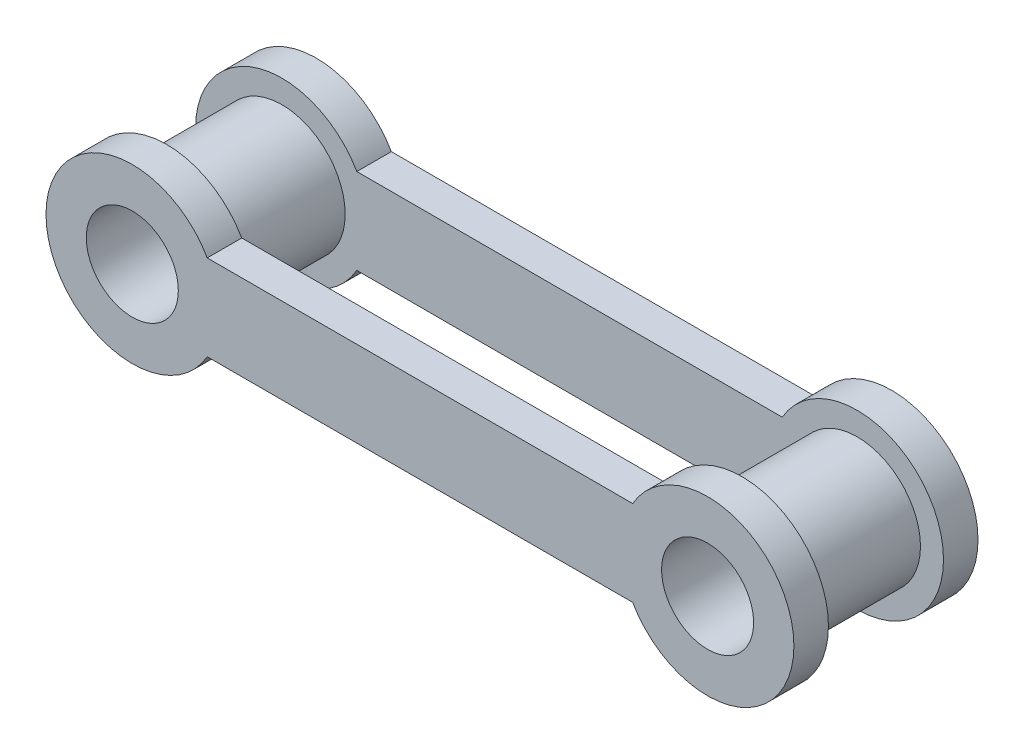
ISO-10303-21;
HEADER;
FILE_DESCRIPTION(('STEP AP214'),'2;1');
FILE_NAME('part.step','',(''),(''),'','','');
FILE_SCHEMA(('AUTOMOTIVE_DESIGN { 1 0 10303 214 1 1 1 1 }'));
ENDSEC;
DATA;
#1=APPLICATION_CONTEXT('core data for automotive mechanical design processes');
#2=APPLICATION_PROTOCOL_DEFINITION('international standard','automotive_design',2000,#1);
#3=PRODUCT_CONTEXT('',#1,'mechanical');
#4=PRODUCT('Part','Part','',(#3));
#5=PRODUCT_RELATED_PRODUCT_CATEGORY('part','',(#4));
#6=PRODUCT_DEFINITION_FORMATION('','',#4);
#7=PRODUCT_DEFINITION_CONTEXT('part definition',#1,'design');
#8=PRODUCT_DEFINITION('design','',#6,#7);
#9=PRODUCT_DEFINITION_SHAPE('','',#8);
#10=(LENGTH_UNIT() NAMED_UNIT(*) SI_UNIT(.MILLI.,.METRE.));
#11=(NAMED_UNIT(*) PLANE_ANGLE_UNIT() SI_UNIT($,.RADIAN.));
#12=(NAMED_UNIT(*) SI_UNIT($,.STERADIAN.) SOLID_ANGLE_UNIT());
#13=UNCERTAINTY_MEASURE_WITH_UNIT(LENGTH_MEASURE(1.E-05),#10,'distance_accuracy_value','');
#14=(GEOMETRIC_REPRESENTATION_CONTEXT(3) GLOBAL_UNCERTAINTY_ASSIGNED_CONTEXT((#13)) GLOBAL_UNIT_ASSIGNED_CONTEXT((#10,
#11,#12)) REPRESENTATION_CONTEXT('',''));
#15=CARTESIAN_POINT('',(0.,0.,0.));
#16=DIRECTION('',(0.,0.,1.));
#17=DIRECTION('',(1.,0.,0.));
#18=AXIS2_PLACEMENT_3D('',#15,#16,#17);
#19=CARTESIAN_POINT('',(-13.0392428409477,1.73580037842723,3.));
#20=DIRECTION('',(0.,0.,1.));
#21=DIRECTION('',(1.,0.,0.));
#22=AXIS2_PLACEMENT_3D('',#19,#20,#21);
#23=PLANE('',#22);
#24=CARTESIAN_POINT('',(-13.0392428409477,1.73580037842723,3.));
#25=DIRECTION('',(0.,0.,1.));
#26=DIRECTION('',(1.,0.,0.));
#27=AXIS2_PLACEMENT_3D('',#24,#25,#26);
#28=CIRCLE('',#27,5.5);
#29=CARTESIAN_POINT('',(-7.53924284094771,1.73580037842723,3.));
#30=VERTEX_POINT('',#29);
#31=EDGE_CURVE('E157',#30,#30,#28,.T.);
#32=ORIENTED_EDGE('',*,*,#31,.F.);
#33=EDGE_LOOP('',(#32));
#34=FACE_BOUND('',#33,.T.);
#35=CARTESIAN_POINT('',(-13.0392428409477,1.73580037842723,3.));
#36=DIRECTION('',(0.,0.,1.));
#37=DIRECTION('',(1.,0.,0.));
#38=AXIS2_PLACEMENT_3D('',#35,#36,#37);
#39=CIRCLE('',#38,7.50000000000001);
#40=CARTESIAN_POINT('',(-6.52657961034547,5.45537261791416,3.));
#41=VERTEX_POINT('',#40);
#42=CARTESIAN_POINT('',(-6.52657961034548,-1.98377186105969,3.));
#43=VERTEX_POINT('',#42);
#44=EDGE_CURVE('E172',#41,#43,#39,.T.);
#45=ORIENTED_EDGE('',*,*,#44,.T.);
#46=DIRECTION('',(1.,0.,0.));
#47=VECTOR('',#46,1.);
#48=CARTESIAN_POINT('',(-6.52657961034548,-1.98377186105969,3.));
#49=LINE('',#48,#47);
#50=CARTESIAN_POINT('',(30.4480939284501,-1.98377186105969,3.));
#51=VERTEX_POINT('',#50);
#52=EDGE_CURVE('E82',#43,#51,#49,.T.);
#53=ORIENTED_EDGE('',*,*,#52,.T.);
#54=CARTESIAN_POINT('',(36.9607571590523,1.73580037842723,3.));
#55=DIRECTION('',(0.,0.,1.));
#56=DIRECTION('',(-1.,0.,0.));
#57=AXIS2_PLACEMENT_3D('',#54,#55,#56);
#58=CIRCLE('',#57,7.50000000000001);
#59=CARTESIAN_POINT('',(30.4480939284501,5.45537261791416,3.));
#60=VERTEX_POINT('',#59);
#61=EDGE_CURVE('E175',#51,#60,#58,.T.);
#62=ORIENTED_EDGE('',*,*,#61,.T.);
#63=DIRECTION('',(-1.,0.,0.));
#64=VECTOR('',#63,1.);
#65=CARTESIAN_POINT('',(-6.52657961034547,5.45537261791416,3.));
#66=LINE('',#65,#64);
#67=EDGE_CURVE('E51',#60,#41,#66,.T.);
#68=ORIENTED_EDGE('',*,*,#67,.T.);
#69=EDGE_LOOP('',(#45,#53,#62,#68));
#70=FACE_BOUND('',#69,.T.);
#71=CARTESIAN_POINT('',(36.9607571590523,1.73580037842723,3.));
#72=DIRECTION('',(0.,0.,1.));
#73=DIRECTION('',(1.,0.,0.));
#74=AXIS2_PLACEMENT_3D('',#71,#72,#73);
#75=CIRCLE('',#74,5.5);
#76=CARTESIAN_POINT('',(42.4607571590523,1.73580037842723,3.));
#77=VERTEX_POINT('',#76);
#78=EDGE_CURVE('E120',#77,#77,#75,.T.);
#79=ORIENTED_EDGE('',*,*,#78,.F.);
#80=EDGE_LOOP('',(#79));
#81=FACE_BOUND('',#80,.T.);
#82=ADVANCED_FACE('F34',(#34,#70,#81),#23,.T.);
#83=CARTESIAN_POINT('',(-13.0392428409477,1.73580037842723,0.));
#84=DIRECTION('',(0.,0.,1.));
#85=DIRECTION('',(1.,0.,0.));
#86=AXIS2_PLACEMENT_3D('',#83,#84,#85);
#87=PLANE('',#86);
#88=CARTESIAN_POINT('',(-13.0392428409477,1.73580037842723,0.));
#89=DIRECTION('',(0.,0.,1.));
#90=DIRECTION('',(1.,0.,0.));
#91=AXIS2_PLACEMENT_3D('',#88,#89,#90);
#92=CIRCLE('',#91,7.50000000000001);
#93=CARTESIAN_POINT('',(-6.52657961034547,5.45537261791416,0.));
#94=VERTEX_POINT('',#93);
#95=CARTESIAN_POINT('',(-6.52657961034548,-1.98377186105969,0.));
#96=VERTEX_POINT('',#95);
#97=EDGE_CURVE('E171',#94,#96,#92,.T.);
#98=ORIENTED_EDGE('',*,*,#97,.F.);
#99=DIRECTION('',(-1.,0.,0.));
#100=VECTOR('',#99,1.);
#101=CARTESIAN_POINT('',(-6.52657961034547,5.45537261791416,0.));
#102=LINE('',#101,#100);
#103=CARTESIAN_POINT('',(30.4480939284501,5.45537261791416,0.));
#104=VERTEX_POINT('',#103);
#105=EDGE_CURVE('E75',#104,#94,#102,.T.);
#106=ORIENTED_EDGE('',*,*,#105,.F.);
#107=CARTESIAN_POINT('',(36.9607571590523,1.73580037842723,0.));
#108=DIRECTION('',(0.,0.,1.));
#109=DIRECTION('',(-1.,0.,0.));
#110=AXIS2_PLACEMENT_3D('',#107,#108,#109);
#111=CIRCLE('',#110,7.50000000000001);
#112=CARTESIAN_POINT('',(30.4480939284501,-1.98377186105969,0.));
#113=VERTEX_POINT('',#112);
#114=EDGE_CURVE('E69',#113,#104,#111,.T.);
#115=ORIENTED_EDGE('',*,*,#114,.F.);
#116=DIRECTION('',(1.,0.,0.));
#117=VECTOR('',#116,1.);
#118=CARTESIAN_POINT('',(-6.52657961034548,-1.98377186105969,0.));
#119=LINE('',#118,#117);
#120=EDGE_CURVE('E181',#96,#113,#119,.T.);
#121=ORIENTED_EDGE('',*,*,#120,.F.);
#122=EDGE_LOOP('',(#98,#106,#115,#121));
#123=FACE_BOUND('',#122,.T.);
#124=CARTESIAN_POINT('',(-13.0392428409477,1.73580037842723,0.));
#125=DIRECTION('',(0.,0.,1.));
#126=DIRECTION('',(1.,0.,0.));
#127=AXIS2_PLACEMENT_3D('',#124,#125,#126);
#128=CIRCLE('',#127,4.);
#129=CARTESIAN_POINT('',(-9.03924284094771,1.73580037842723,0.));
#130=VERTEX_POINT('',#129);
#131=EDGE_CURVE('E168',#130,#130,#128,.T.);
#132=ORIENTED_EDGE('',*,*,#131,.T.);
#133=EDGE_LOOP('',(#132));
#134=FACE_BOUND('',#133,.T.);
#135=CARTESIAN_POINT('',(36.9607571590523,1.73580037842723,0.));
#136=DIRECTION('',(0.,0.,1.));
#137=DIRECTION('',(-1.,0.,0.));
#138=AXIS2_PLACEMENT_3D('',#135,#136,#137);
#139=CIRCLE('',#138,4.);
#140=CARTESIAN_POINT('',(32.9607571590523,1.73580037842723,0.));
#141=VERTEX_POINT('',#140);
#142=EDGE_CURVE('E163',#141,#141,#139,.T.);
#143=ORIENTED_EDGE('',*,*,#142,.T.);
#144=EDGE_LOOP('',(#143));
#145=FACE_BOUND('',#144,.T.);
#146=ADVANCED_FACE('F191',(#123,#134,#145),#87,.F.);
#147=CARTESIAN_POINT('',(-13.0392428409477,1.73580037842723,3.));
#148=DIRECTION('',(0.,0.,-1.));
#149=DIRECTION('',(-1.,0.,0.));
#150=AXIS2_PLACEMENT_3D('',#147,#148,#149);
#151=CYLINDRICAL_SURFACE('',#150,7.50000000000001);
#152=ORIENTED_EDGE('',*,*,#97,.T.);
#153=DIRECTION('',(0.,0.,-1.));
#154=VECTOR('',#153,1.);
#155=CARTESIAN_POINT('',(-6.52657961034548,-1.98377186105969,3.));
#156=LINE('',#155,#154);
#157=EDGE_CURVE('E11',#43,#96,#156,.T.);
#158=ORIENTED_EDGE('',*,*,#157,.F.);
#159=ORIENTED_EDGE('',*,*,#44,.F.);
#160=DIRECTION('',(0.,0.,-1.));
#161=VECTOR('',#160,1.);
#162=CARTESIAN_POINT('',(-6.52657961034547,5.45537261791416,3.));
#163=LINE('',#162,#161);
#164=EDGE_CURVE('E178',#41,#94,#163,.T.);
#165=ORIENTED_EDGE('',*,*,#164,.T.);
#166=EDGE_LOOP('',(#152,#158,#159,#165));
#167=FACE_BOUND('',#166,.T.);
#168=ADVANCED_FACE('F36',(#167),#151,.T.);
#169=CARTESIAN_POINT('',(-6.52657961034548,-1.98377186105969,3.));
#170=DIRECTION('',(0.,1.,0.));
#171=DIRECTION('',(0.,0.,1.));
#172=AXIS2_PLACEMENT_3D('',#169,#170,#171);
#173=PLANE('',#172);
#174=ORIENTED_EDGE('',*,*,#120,.T.);
#175=DIRECTION('',(0.,0.,-1.));
#176=VECTOR('',#175,1.);
#177=CARTESIAN_POINT('',(30.4480939284501,-1.98377186105969,3.));
#178=LINE('',#177,#176);
#179=EDGE_CURVE('E43',#51,#113,#178,.T.);
#180=ORIENTED_EDGE('',*,*,#179,.F.);
#181=ORIENTED_EDGE('',*,*,#52,.F.);
#182=ORIENTED_EDGE('',*,*,#157,.T.);
#183=EDGE_LOOP('',(#174,#180,#181,#182));
#184=FACE_BOUND('',#183,.T.);
#185=ADVANCED_FACE('F207',(#184),#173,.F.);
#186=CARTESIAN_POINT('',(36.9607571590523,1.73580037842723,3.));
#187=DIRECTION('',(0.,0.,-1.));
#188=DIRECTION('',(-1.,0.,0.));
#189=AXIS2_PLACEMENT_3D('',#186,#187,#188);
#190=CYLINDRICAL_SURFACE('',#189,7.50000000000001);
#191=ORIENTED_EDGE('',*,*,#114,.T.);
#192=DIRECTION('',(0.,0.,-1.));
#193=VECTOR('',#192,1.);
#194=CARTESIAN_POINT('',(30.4480939284501,5.45537261791416,3.));
#195=LINE('',#194,#193);
#196=EDGE_CURVE('E186',#60,#104,#195,.T.);
#197=ORIENTED_EDGE('',*,*,#196,.F.);
#198=ORIENTED_EDGE('',*,*,#61,.F.);
#199=ORIENTED_EDGE('',*,*,#179,.T.);
#200=EDGE_LOOP('',(#191,#197,#198,#199));
#201=FACE_BOUND('',#200,.T.);
#202=ADVANCED_FACE('F188',(#201),#190,.T.);
#203=CARTESIAN_POINT('',(-6.52657961034547,5.45537261791416,3.));
#204=DIRECTION('',(0.,-1.,0.));
#205=DIRECTION('',(0.,0.,-1.));
#206=AXIS2_PLACEMENT_3D('',#203,#204,#205);
#207=PLANE('',#206);
#208=ORIENTED_EDGE('',*,*,#105,.T.);
#209=ORIENTED_EDGE('',*,*,#164,.F.);
#210=ORIENTED_EDGE('',*,*,#67,.F.);
#211=ORIENTED_EDGE('',*,*,#196,.T.);
#212=EDGE_LOOP('',(#208,#209,#210,#211));
#213=FACE_BOUND('',#212,.T.);
#214=ADVANCED_FACE('F196',(#213),#207,.F.);
#215=CARTESIAN_POINT('',(-13.0392428409477,1.73580037842723,3.));
#216=DIRECTION('',(0.,0.,-1.));
#217=DIRECTION('',(-1.,0.,0.));
#218=AXIS2_PLACEMENT_3D('',#215,#216,#217);
#219=CYLINDRICAL_SURFACE('',#218,4.);
#220=ORIENTED_EDGE('',*,*,#131,.F.);
#221=EDGE_LOOP('',(#220));
#222=FACE_BOUND('',#221,.T.);
#223=CARTESIAN_POINT('',(-13.0392428409477,1.73580037842723,16.));
#224=DIRECTION('',(0.,0.,1.));
#225=DIRECTION('',(1.,0.,0.));
#226=AXIS2_PLACEMENT_3D('',#223,#224,#225);
#227=CIRCLE('',#226,4.);
#228=CARTESIAN_POINT('',(-9.03924284094771,1.73580037842723,16.));
#229=VERTEX_POINT('',#228);
#230=EDGE_CURVE('E143',#229,#229,#227,.T.);
#231=ORIENTED_EDGE('',*,*,#230,.T.);
#232=EDGE_LOOP('',(#231));
#233=FACE_BOUND('',#232,.T.);
#234=ADVANCED_FACE('F198',(#222,#233),#219,.F.);
#235=CARTESIAN_POINT('',(36.9607571590523,1.73580037842723,3.));
#236=DIRECTION('',(0.,0.,-1.));
#237=DIRECTION('',(-1.,0.,0.));
#238=AXIS2_PLACEMENT_3D('',#235,#236,#237);
#239=CYLINDRICAL_SURFACE('',#238,4.);
#240=ORIENTED_EDGE('',*,*,#142,.F.);
#241=EDGE_LOOP('',(#240));
#242=FACE_BOUND('',#241,.T.);
#243=CARTESIAN_POINT('',(36.9607571590523,1.73580037842723,16.));
#244=DIRECTION('',(0.,0.,1.));
#245=DIRECTION('',(-1.,0.,0.));
#246=AXIS2_PLACEMENT_3D('',#243,#244,#245);
#247=CIRCLE('',#246,4.);
#248=CARTESIAN_POINT('',(32.9607571590523,1.73580037842723,16.));
#249=VERTEX_POINT('',#248);
#250=EDGE_CURVE('E363',#249,#249,#247,.T.);
#251=ORIENTED_EDGE('',*,*,#250,.T.);
#252=EDGE_LOOP('',(#251));
#253=FACE_BOUND('',#252,.T.);
#254=ADVANCED_FACE('F204',(#242,#253),#239,.F.);
#255=CARTESIAN_POINT('',(-13.0392428409477,1.73580037842723,13.));
#256=DIRECTION('',(0.,0.,-1.));
#257=DIRECTION('',(-1.,0.,0.));
#258=AXIS2_PLACEMENT_3D('',#255,#256,#257);
#259=CYLINDRICAL_SURFACE('',#258,5.5);
#260=CARTESIAN_POINT('',(-13.0392428409477,1.73580037842723,13.));
#261=DIRECTION('',(0.,0.,1.));
#262=DIRECTION('',(1.,0.,0.));
#263=AXIS2_PLACEMENT_3D('',#260,#261,#262);
#264=CIRCLE('',#263,5.5);
#265=CARTESIAN_POINT('',(-7.53924284094771,1.73580037842723,13.));
#266=VERTEX_POINT('',#265);
#267=EDGE_CURVE('E160',#266,#266,#264,.T.);
#268=ORIENTED_EDGE('',*,*,#267,.F.);
#269=EDGE_LOOP('',(#268));
#270=FACE_BOUND('',#269,.T.);
#271=ORIENTED_EDGE('',*,*,#31,.T.);
#272=EDGE_LOOP('',(#271));
#273=FACE_BOUND('',#272,.T.);
#274=ADVANCED_FACE('F220',(#270,#273),#259,.T.);
#275=CARTESIAN_POINT('',(36.9607571590523,1.73580037842723,13.));
#276=DIRECTION('',(0.,0.,-1.));
#277=DIRECTION('',(-1.,0.,0.));
#278=AXIS2_PLACEMENT_3D('',#275,#276,#277);
#279=CYLINDRICAL_SURFACE('',#278,5.5);
#280=CARTESIAN_POINT('',(36.9607571590523,1.73580037842723,13.));
#281=DIRECTION('',(0.,0.,1.));
#282=DIRECTION('',(1.,0.,0.));
#283=AXIS2_PLACEMENT_3D('',#280,#281,#282);
#284=CIRCLE('',#283,5.5);
#285=CARTESIAN_POINT('',(42.4607571590523,1.73580037842723,13.));
#286=VERTEX_POINT('',#285);
#287=EDGE_CURVE('E154',#286,#286,#284,.T.);
#288=ORIENTED_EDGE('',*,*,#287,.F.);
#289=EDGE_LOOP('',(#288));
#290=FACE_BOUND('',#289,.T.);
#291=ORIENTED_EDGE('',*,*,#78,.T.);
#292=EDGE_LOOP('',(#291));
#293=FACE_BOUND('',#292,.T.);
#294=ADVANCED_FACE('F224',(#290,#293),#279,.T.);
#295=CARTESIAN_POINT('',(-13.0392428409477,1.73580037842723,13.));
#296=DIRECTION('',(0.,0.,1.));
#297=DIRECTION('',(1.,0.,0.));
#298=AXIS2_PLACEMENT_3D('',#295,#296,#297);
#299=CYLINDRICAL_SURFACE('',#298,7.50000000000001);
#300=CARTESIAN_POINT('',(-13.0392428409477,1.73580037842723,16.));
#301=DIRECTION('',(0.,0.,1.));
#302=DIRECTION('',(1.,0.,0.));
#303=AXIS2_PLACEMENT_3D('',#300,#301,#302);
#304=CIRCLE('',#303,7.50000000000001);
#305=CARTESIAN_POINT('',(-6.52657961034547,5.45537261791416,16.));
#306=VERTEX_POINT('',#305);
#307=CARTESIAN_POINT('',(-6.52657961034548,-1.98377186105969,16.));
#308=VERTEX_POINT('',#307);
#309=EDGE_CURVE('E115',#306,#308,#304,.T.);
#310=ORIENTED_EDGE('',*,*,#309,.F.);
#311=DIRECTION('',(0.,0.,1.));
#312=VECTOR('',#311,1.);
#313=CARTESIAN_POINT('',(-6.52657961034547,5.45537261791416,13.));
#314=LINE('',#313,#312);
#315=CARTESIAN_POINT('',(-6.52657961034547,5.45537261791416,13.));
#316=VERTEX_POINT('',#315);
#317=EDGE_CURVE('E109',#316,#306,#314,.T.);
#318=ORIENTED_EDGE('',*,*,#317,.F.);
#319=CARTESIAN_POINT('',(-13.0392428409477,1.73580037842723,13.));
#320=DIRECTION('',(0.,0.,1.));
#321=DIRECTION('',(1.,0.,0.));
#322=AXIS2_PLACEMENT_3D('',#319,#320,#321);
#323=CIRCLE('',#322,7.50000000000001);
#324=CARTESIAN_POINT('',(-6.52657961034548,-1.98377186105969,13.));
#325=VERTEX_POINT('',#324);
#326=EDGE_CURVE('E112',#316,#325,#323,.T.);
#327=ORIENTED_EDGE('',*,*,#326,.T.);
#328=DIRECTION('',(0.,0.,1.));
#329=VECTOR('',#328,1.);
#330=CARTESIAN_POINT('',(-6.52657961034548,-1.98377186105969,13.));
#331=LINE('',#330,#329);
#332=EDGE_CURVE('E140',#325,#308,#331,.T.);
#333=ORIENTED_EDGE('',*,*,#332,.T.);
#334=EDGE_LOOP('',(#310,#318,#327,#333));
#335=FACE_BOUND('',#334,.T.);
#336=ADVANCED_FACE('F111',(#335),#299,.T.);
#337=CARTESIAN_POINT('',(-6.52657961034547,5.45537261791416,13.));
#338=DIRECTION('',(0.,1.,0.));
#339=DIRECTION('',(0.,0.,1.));
#340=AXIS2_PLACEMENT_3D('',#337,#338,#339);
#341=PLANE('',#340);
#342=DIRECTION('',(-1.,0.,0.));
#343=VECTOR('',#342,1.);
#344=CARTESIAN_POINT('',(-6.52657961034547,5.45537261791416,16.));
#345=LINE('',#344,#343);
#346=CARTESIAN_POINT('',(30.4480939284501,5.45537261791416,16.));
#347=VERTEX_POINT('',#346);
#348=EDGE_CURVE('E142',#347,#306,#345,.T.);
#349=ORIENTED_EDGE('',*,*,#348,.F.);
#350=DIRECTION('',(0.,0.,1.));
#351=VECTOR('',#350,1.);
#352=CARTESIAN_POINT('',(30.4480939284501,5.45537261791416,13.));
#353=LINE('',#352,#351);
#354=CARTESIAN_POINT('',(30.4480939284501,5.45537261791416,13.));
#355=VERTEX_POINT('',#354);
#356=EDGE_CURVE('E121',#355,#347,#353,.T.);
#357=ORIENTED_EDGE('',*,*,#356,.F.);
#358=DIRECTION('',(-1.,0.,0.));
#359=VECTOR('',#358,1.);
#360=CARTESIAN_POINT('',(-6.52657961034547,5.45537261791416,13.));
#361=LINE('',#360,#359);
#362=EDGE_CURVE('E127',#355,#316,#361,.T.);
#363=ORIENTED_EDGE('',*,*,#362,.T.);
#364=ORIENTED_EDGE('',*,*,#317,.T.);
#365=EDGE_LOOP('',(#349,#357,#363,#364));
#366=FACE_BOUND('',#365,.T.);
#367=ADVANCED_FACE('F133',(#366),#341,.T.);
#368=CARTESIAN_POINT('',(36.9607571590523,1.73580037842723,13.));
#369=DIRECTION('',(0.,0.,1.));
#370=DIRECTION('',(1.,0.,0.));
#371=AXIS2_PLACEMENT_3D('',#368,#369,#370);
#372=CYLINDRICAL_SURFACE('',#371,7.50000000000001);
#373=CARTESIAN_POINT('',(36.9607571590523,1.73580037842723,16.));
#374=DIRECTION('',(0.,0.,1.));
#375=DIRECTION('',(-1.,0.,0.));
#376=AXIS2_PLACEMENT_3D('',#373,#374,#375);
#377=CIRCLE('',#376,7.50000000000001);
#378=CARTESIAN_POINT('',(30.4480939284501,-1.98377186105969,16.));
#379=VERTEX_POINT('',#378);
#380=EDGE_CURVE('E145',#379,#347,#377,.T.);
#381=ORIENTED_EDGE('',*,*,#380,.F.);
#382=DIRECTION('',(0.,0.,1.));
#383=VECTOR('',#382,1.);
#384=CARTESIAN_POINT('',(30.4480939284501,-1.98377186105969,13.));
#385=LINE('',#384,#383);
#386=CARTESIAN_POINT('',(30.4480939284501,-1.98377186105969,13.));
#387=VERTEX_POINT('',#386);
#388=EDGE_CURVE('E151',#387,#379,#385,.T.);
#389=ORIENTED_EDGE('',*,*,#388,.F.);
#390=CARTESIAN_POINT('',(36.9607571590523,1.73580037842723,13.));
#391=DIRECTION('',(0.,0.,1.));
#392=DIRECTION('',(-1.,0.,0.));
#393=AXIS2_PLACEMENT_3D('',#390,#391,#392);
#394=CIRCLE('',#393,7.50000000000001);
#395=EDGE_CURVE('E134',#387,#355,#394,.T.);
#396=ORIENTED_EDGE('',*,*,#395,.T.);
#397=ORIENTED_EDGE('',*,*,#356,.T.);
#398=EDGE_LOOP('',(#381,#389,#396,#397));
#399=FACE_BOUND('',#398,.T.);
#400=ADVANCED_FACE('F233',(#399),#372,.T.);
#401=CARTESIAN_POINT('',(-6.52657961034548,-1.98377186105969,13.));
#402=DIRECTION('',(0.,-1.,0.));
#403=DIRECTION('',(0.,0.,-1.));
#404=AXIS2_PLACEMENT_3D('',#401,#402,#403);
#405=PLANE('',#404);
#406=DIRECTION('',(1.,0.,0.));
#407=VECTOR('',#406,1.);
#408=CARTESIAN_POINT('',(-6.52657961034548,-1.98377186105969,16.));
#409=LINE('',#408,#407);
#410=EDGE_CURVE('E131',#308,#379,#409,.T.);
#411=ORIENTED_EDGE('',*,*,#410,.F.);
#412=ORIENTED_EDGE('',*,*,#332,.F.);
#413=DIRECTION('',(1.,0.,0.));
#414=VECTOR('',#413,1.);
#415=CARTESIAN_POINT('',(-6.52657961034548,-1.98377186105969,13.));
#416=LINE('',#415,#414);
#417=EDGE_CURVE('E130',#325,#387,#416,.T.);
#418=ORIENTED_EDGE('',*,*,#417,.T.);
#419=ORIENTED_EDGE('',*,*,#388,.T.);
#420=EDGE_LOOP('',(#411,#412,#418,#419));
#421=FACE_BOUND('',#420,.T.);
#422=ADVANCED_FACE('F236',(#421),#405,.T.);
#423=CARTESIAN_POINT('',(-13.0392428409477,1.73580037842723,13.));
#424=DIRECTION('',(0.,0.,-1.));
#425=DIRECTION('',(1.,0.,0.));
#426=AXIS2_PLACEMENT_3D('',#423,#424,#425);
#427=PLANE('',#426);
#428=ORIENTED_EDGE('',*,*,#267,.T.);
#429=EDGE_LOOP('',(#428));
#430=FACE_BOUND('',#429,.T.);
#431=ORIENTED_EDGE('',*,*,#287,.T.);
#432=EDGE_LOOP('',(#431));
#433=FACE_BOUND('',#432,.T.);
#434=ORIENTED_EDGE('',*,*,#326,.F.);
#435=ORIENTED_EDGE('',*,*,#362,.F.);
#436=ORIENTED_EDGE('',*,*,#395,.F.);
#437=ORIENTED_EDGE('',*,*,#417,.F.);
#438=EDGE_LOOP('',(#434,#435,#436,#437));
#439=FACE_BOUND('',#438,.T.);
#440=ADVANCED_FACE('F125',(#430,#433,#439),#427,.T.);
#441=CARTESIAN_POINT('',(-13.0392428409477,1.73580037842723,16.));
#442=DIRECTION('',(0.,0.,-1.));
#443=DIRECTION('',(1.,0.,0.));
#444=AXIS2_PLACEMENT_3D('',#441,#442,#443);
#445=PLANE('',#444);
#446=ORIENTED_EDGE('',*,*,#250,.F.);
#447=EDGE_LOOP('',(#446));
#448=FACE_BOUND('',#447,.T.);
#449=ORIENTED_EDGE('',*,*,#230,.F.);
#450=EDGE_LOOP('',(#449));
#451=FACE_BOUND('',#450,.T.);
#452=ORIENTED_EDGE('',*,*,#309,.T.);
#453=ORIENTED_EDGE('',*,*,#410,.T.);
#454=ORIENTED_EDGE('',*,*,#380,.T.);
#455=ORIENTED_EDGE('',*,*,#348,.T.);
#456=EDGE_LOOP('',(#452,#453,#454,#455));
#457=FACE_BOUND('',#456,.T.);
#458=ADVANCED_FACE('F241',(#448,#451,#457),#445,.F.);
#459=CLOSED_SHELL('',(#82,#146,#168,#185,#202,#214,#234,#254,#274,#294,#336,#367,#400,#422,#440,#458));
#460=MANIFOLD_SOLID_BREP('B2',#459);
#461=ADVANCED_BREP_SHAPE_REPRESENTATION('',(#18,#460),#14);
#462=SHAPE_DEFINITION_REPRESENTATION(#9,#461);
ENDSEC;
END-ISO-10303-21;
